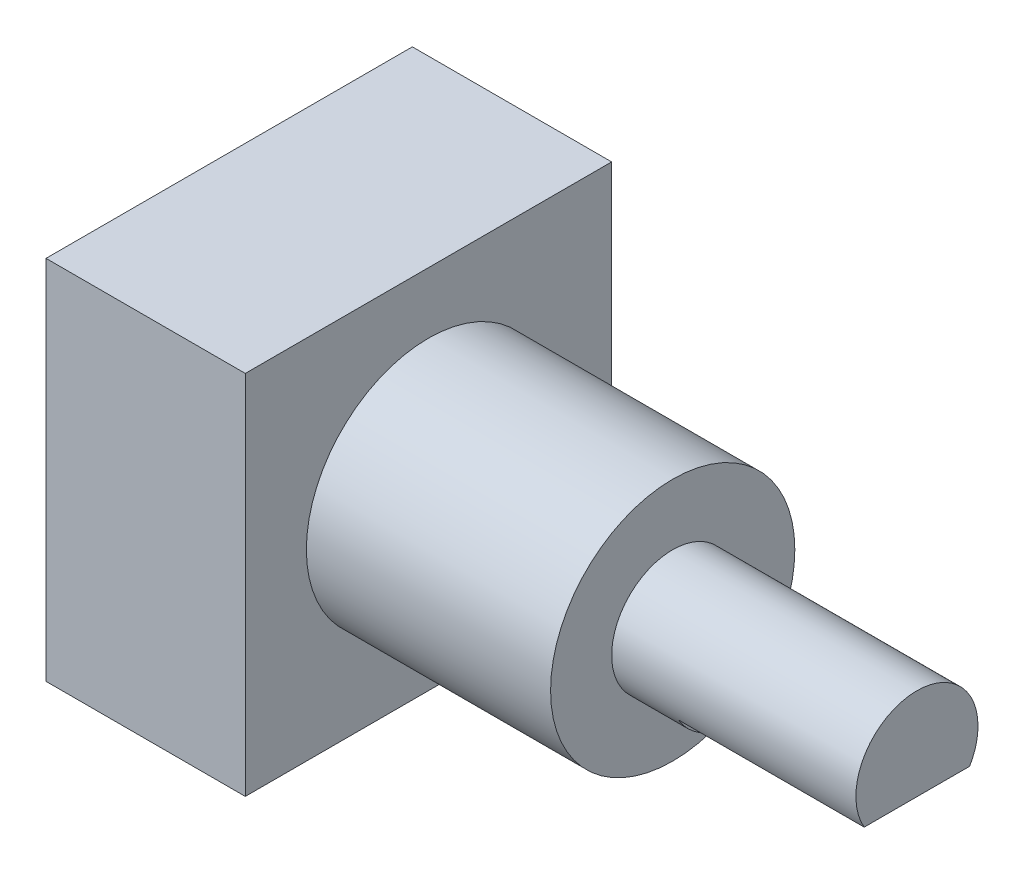
ISO-10303-21;
HEADER;
FILE_DESCRIPTION(('STEP AP214'),'2;1');
FILE_NAME('part.step','',(''),(''),'','','');
FILE_SCHEMA(('AUTOMOTIVE_DESIGN { 1 0 10303 214 1 1 1 1 }'));
ENDSEC;
DATA;
#1=APPLICATION_CONTEXT('core data for automotive mechanical design processes');
#2=APPLICATION_PROTOCOL_DEFINITION('international standard','automotive_design',2000,#1);
#3=PRODUCT_CONTEXT('',#1,'mechanical');
#4=PRODUCT('Part','Part','',(#3));
#5=PRODUCT_RELATED_PRODUCT_CATEGORY('part','',(#4));
#6=PRODUCT_DEFINITION_FORMATION('','',#4);
#7=PRODUCT_DEFINITION_CONTEXT('part definition',#1,'design');
#8=PRODUCT_DEFINITION('design','',#6,#7);
#9=PRODUCT_DEFINITION_SHAPE('','',#8);
#10=(LENGTH_UNIT() NAMED_UNIT(*) SI_UNIT(.MILLI.,.METRE.));
#11=(NAMED_UNIT(*) PLANE_ANGLE_UNIT() SI_UNIT($,.RADIAN.));
#12=(NAMED_UNIT(*) SI_UNIT($,.STERADIAN.) SOLID_ANGLE_UNIT());
#13=UNCERTAINTY_MEASURE_WITH_UNIT(LENGTH_MEASURE(1.E-05),#10,'distance_accuracy_value','');
#14=(GEOMETRIC_REPRESENTATION_CONTEXT(3) GLOBAL_UNCERTAINTY_ASSIGNED_CONTEXT((#13)) GLOBAL_UNIT_ASSIGNED_CONTEXT((#10,
#11,#12)) REPRESENTATION_CONTEXT('',''));
#15=CARTESIAN_POINT('',(0.,0.,0.));
#16=DIRECTION('',(0.,0.,1.));
#17=DIRECTION('',(1.,0.,0.));
#18=AXIS2_PLACEMENT_3D('',#15,#16,#17);
#19=CARTESIAN_POINT('',(0.,0.,0.));
#20=DIRECTION('',(1.,0.,0.));
#21=DIRECTION('',(0.,0.,-1.));
#22=AXIS2_PLACEMENT_3D('',#19,#20,#21);
#23=CYLINDRICAL_SURFACE('',#22,3.175);
#24=CARTESIAN_POINT('',(0.,0.,0.));
#25=DIRECTION('',(-1.,0.,0.));
#26=DIRECTION('',(0.,0.,1.));
#27=AXIS2_PLACEMENT_3D('',#24,#25,#26);
#28=CIRCLE('',#27,3.175);
#29=CARTESIAN_POINT('',(0.,0.,3.175));
#30=VERTEX_POINT('',#29);
#31=EDGE_CURVE('E138',#30,#30,#28,.F.);
#32=ORIENTED_EDGE('',*,*,#31,.T.);
#33=EDGE_LOOP('',(#32));
#34=FACE_BOUND('',#33,.T.);
#35=CARTESIAN_POINT('',(6.35,0.,0.));
#36=DIRECTION('',(1.,0.,0.));
#37=DIRECTION('',(0.,0.,-1.));
#38=AXIS2_PLACEMENT_3D('',#35,#36,#37);
#39=CIRCLE('',#38,3.175);
#40=CARTESIAN_POINT('',(6.35,0.,-3.175));
#41=VERTEX_POINT('',#40);
#42=EDGE_CURVE('E11',#41,#41,#39,.T.);
#43=ORIENTED_EDGE('',*,*,#42,.F.);
#44=EDGE_LOOP('',(#43));
#45=FACE_BOUND('',#44,.T.);
#46=ADVANCED_FACE('F35',(#34,#45),#23,.T.);
#47=CARTESIAN_POINT('',(6.35,3.175,0.));
#48=DIRECTION('',(1.,0.,0.));
#49=DIRECTION('',(0.,0.,-1.));
#50=AXIS2_PLACEMENT_3D('',#47,#48,#49);
#51=PLANE('',#50);
#52=ORIENTED_EDGE('',*,*,#42,.T.);
#53=EDGE_LOOP('',(#52));
#54=FACE_BOUND('',#53,.T.);
#55=CARTESIAN_POINT('',(6.35,0.,0.));
#56=DIRECTION('',(1.,0.,0.));
#57=DIRECTION('',(0.,0.,-1.));
#58=AXIS2_PLACEMENT_3D('',#55,#56,#57);
#59=CIRCLE('',#58,1.5875);
#60=CARTESIAN_POINT('',(6.35,0.,-1.5875));
#61=VERTEX_POINT('',#60);
#62=EDGE_CURVE('E42',#61,#61,#59,.T.);
#63=ORIENTED_EDGE('',*,*,#62,.F.);
#64=EDGE_LOOP('',(#63));
#65=FACE_BOUND('',#64,.T.);
#66=ADVANCED_FACE('F149',(#54,#65),#51,.T.);
#67=CARTESIAN_POINT('',(0.,0.,0.));
#68=DIRECTION('',(1.,0.,0.));
#69=DIRECTION('',(0.,0.,-1.));
#70=AXIS2_PLACEMENT_3D('',#67,#68,#69);
#71=CYLINDRICAL_SURFACE('',#70,1.5875);
#72=DIRECTION('',(1.,0.,0.));
#73=VECTOR('',#72,1.);
#74=CARTESIAN_POINT('',(7.874,-0.800099999999999,1.3711295489486));
#75=LINE('',#74,#73);
#76=CARTESIAN_POINT('',(7.874,-0.800099999999999,1.3711295489486));
#77=VERTEX_POINT('',#76);
#78=CARTESIAN_POINT('',(12.7,-0.800099999999999,1.3711295489486));
#79=VERTEX_POINT('',#78);
#80=EDGE_CURVE('E105',#77,#79,#75,.T.);
#81=ORIENTED_EDGE('',*,*,#80,.T.);
#82=CARTESIAN_POINT('',(12.7,0.,0.));
#83=DIRECTION('',(1.,0.,0.));
#84=DIRECTION('',(0.,0.,-1.));
#85=AXIS2_PLACEMENT_3D('',#82,#83,#84);
#86=CIRCLE('',#85,1.5875);
#87=CARTESIAN_POINT('',(12.7,-0.800099999999999,-1.3711295489486));
#88=VERTEX_POINT('',#87);
#89=EDGE_CURVE('E111',#88,#79,#86,.T.);
#90=ORIENTED_EDGE('',*,*,#89,.F.);
#91=DIRECTION('',(1.,0.,0.));
#92=VECTOR('',#91,1.);
#93=CARTESIAN_POINT('',(7.874,-0.800099999999999,-1.3711295489486));
#94=LINE('',#93,#92);
#95=CARTESIAN_POINT('',(7.874,-0.800099999999999,-1.3711295489486));
#96=VERTEX_POINT('',#95);
#97=EDGE_CURVE('E49',#96,#88,#94,.T.);
#98=ORIENTED_EDGE('',*,*,#97,.F.);
#99=CARTESIAN_POINT('',(7.874,0.,0.));
#100=DIRECTION('',(1.,0.,0.));
#101=DIRECTION('',(0.,0.,-1.));
#102=AXIS2_PLACEMENT_3D('',#99,#100,#101);
#103=CIRCLE('',#102,1.5875);
#104=EDGE_CURVE('E97',#77,#96,#103,.T.);
#105=ORIENTED_EDGE('',*,*,#104,.F.);
#106=EDGE_LOOP('',(#81,#90,#98,#105));
#107=FACE_BOUND('',#106,.T.);
#108=ORIENTED_EDGE('',*,*,#62,.T.);
#109=EDGE_LOOP('',(#108));
#110=FACE_BOUND('',#109,.T.);
#111=ADVANCED_FACE('F108',(#107,#110),#71,.T.);
#112=CARTESIAN_POINT('',(12.7,1.5875,0.));
#113=DIRECTION('',(1.,0.,0.));
#114=DIRECTION('',(0.,0.,-1.));
#115=AXIS2_PLACEMENT_3D('',#112,#113,#114);
#116=PLANE('',#115);
#117=DIRECTION('',(0.,0.,1.));
#118=VECTOR('',#117,1.);
#119=CARTESIAN_POINT('',(12.7,-0.800099999999999,1.3711295489486));
#120=LINE('',#119,#118);
#121=EDGE_CURVE('E102',#88,#79,#120,.T.);
#122=ORIENTED_EDGE('',*,*,#121,.F.);
#123=ORIENTED_EDGE('',*,*,#89,.T.);
#124=EDGE_LOOP('',(#122,#123));
#125=FACE_BOUND('',#124,.T.);
#126=ADVANCED_FACE('F156',(#125),#116,.T.);
#127=CARTESIAN_POINT('',(-5.1816,-4.7625,-4.7625));
#128=DIRECTION('',(0.,0.,-1.));
#129=DIRECTION('',(-1.,0.,0.));
#130=AXIS2_PLACEMENT_3D('',#127,#128,#129);
#131=PLANE('',#130);
#132=DIRECTION('',(0.,1.,0.));
#133=VECTOR('',#132,1.);
#134=CARTESIAN_POINT('',(0.,-4.7625,-4.7625));
#135=LINE('',#134,#133);
#136=CARTESIAN_POINT('',(0.,-4.7625,-4.7625));
#137=VERTEX_POINT('',#136);
#138=CARTESIAN_POINT('',(0.,4.7625,-4.7625));
#139=VERTEX_POINT('',#138);
#140=EDGE_CURVE('E113',#137,#139,#135,.T.);
#141=ORIENTED_EDGE('',*,*,#140,.F.);
#142=DIRECTION('',(1.,0.,0.));
#143=VECTOR('',#142,1.);
#144=CARTESIAN_POINT('',(-5.1816,-4.7625,-4.7625));
#145=LINE('',#144,#143);
#146=CARTESIAN_POINT('',(-5.1816,-4.7625,-4.7625));
#147=VERTEX_POINT('',#146);
#148=EDGE_CURVE('E58',#147,#137,#145,.T.);
#149=ORIENTED_EDGE('',*,*,#148,.F.);
#150=DIRECTION('',(0.,1.,0.));
#151=VECTOR('',#150,1.);
#152=CARTESIAN_POINT('',(-5.1816,-4.7625,-4.7625));
#153=LINE('',#152,#151);
#154=CARTESIAN_POINT('',(-5.1816,4.7625,-4.7625));
#155=VERTEX_POINT('',#154);
#156=EDGE_CURVE('E117',#147,#155,#153,.T.);
#157=ORIENTED_EDGE('',*,*,#156,.T.);
#158=DIRECTION('',(1.,0.,0.));
#159=VECTOR('',#158,1.);
#160=CARTESIAN_POINT('',(-5.1816,4.7625,-4.7625));
#161=LINE('',#160,#159);
#162=EDGE_CURVE('E84',#155,#139,#161,.T.);
#163=ORIENTED_EDGE('',*,*,#162,.T.);
#164=EDGE_LOOP('',(#141,#149,#157,#163));
#165=FACE_BOUND('',#164,.T.);
#166=ADVANCED_FACE('F162',(#165),#131,.T.);
#167=CARTESIAN_POINT('',(-5.1816,-4.7625,4.7625));
#168=DIRECTION('',(0.,-1.,0.));
#169=DIRECTION('',(0.,0.,-1.));
#170=AXIS2_PLACEMENT_3D('',#167,#168,#169);
#171=PLANE('',#170);
#172=DIRECTION('',(0.,0.,-1.));
#173=VECTOR('',#172,1.);
#174=CARTESIAN_POINT('',(0.,-4.7625,4.7625));
#175=LINE('',#174,#173);
#176=CARTESIAN_POINT('',(0.,-4.7625,4.7625));
#177=VERTEX_POINT('',#176);
#178=EDGE_CURVE('E120',#177,#137,#175,.T.);
#179=ORIENTED_EDGE('',*,*,#178,.F.);
#180=DIRECTION('',(1.,0.,0.));
#181=VECTOR('',#180,1.);
#182=CARTESIAN_POINT('',(-5.1816,-4.7625,4.7625));
#183=LINE('',#182,#181);
#184=CARTESIAN_POINT('',(-5.1816,-4.7625,4.7625));
#185=VERTEX_POINT('',#184);
#186=EDGE_CURVE('E139',#185,#177,#183,.T.);
#187=ORIENTED_EDGE('',*,*,#186,.F.);
#188=DIRECTION('',(0.,0.,-1.));
#189=VECTOR('',#188,1.);
#190=CARTESIAN_POINT('',(-5.1816,-4.7625,4.7625));
#191=LINE('',#190,#189);
#192=EDGE_CURVE('E125',#185,#147,#191,.T.);
#193=ORIENTED_EDGE('',*,*,#192,.T.);
#194=ORIENTED_EDGE('',*,*,#148,.T.);
#195=EDGE_LOOP('',(#179,#187,#193,#194));
#196=FACE_BOUND('',#195,.T.);
#197=ADVANCED_FACE('F166',(#196),#171,.T.);
#198=CARTESIAN_POINT('',(-5.1816,-4.7625,4.7625));
#199=DIRECTION('',(0.,0.,1.));
#200=DIRECTION('',(1.,0.,0.));
#201=AXIS2_PLACEMENT_3D('',#198,#199,#200);
#202=PLANE('',#201);
#203=DIRECTION('',(0.,-1.,0.));
#204=VECTOR('',#203,1.);
#205=CARTESIAN_POINT('',(0.,-4.7625,4.7625));
#206=LINE('',#205,#204);
#207=CARTESIAN_POINT('',(0.,4.7625,4.7625));
#208=VERTEX_POINT('',#207);
#209=EDGE_CURVE('E132',#208,#177,#206,.T.);
#210=ORIENTED_EDGE('',*,*,#209,.F.);
#211=DIRECTION('',(1.,0.,0.));
#212=VECTOR('',#211,1.);
#213=CARTESIAN_POINT('',(-5.1816,4.7625,4.7625));
#214=LINE('',#213,#212);
#215=CARTESIAN_POINT('',(-5.1816,4.7625,4.7625));
#216=VERTEX_POINT('',#215);
#217=EDGE_CURVE('E141',#216,#208,#214,.T.);
#218=ORIENTED_EDGE('',*,*,#217,.F.);
#219=DIRECTION('',(0.,-1.,0.));
#220=VECTOR('',#219,1.);
#221=CARTESIAN_POINT('',(-5.1816,-4.7625,4.7625));
#222=LINE('',#221,#220);
#223=EDGE_CURVE('E122',#216,#185,#222,.T.);
#224=ORIENTED_EDGE('',*,*,#223,.T.);
#225=ORIENTED_EDGE('',*,*,#186,.T.);
#226=EDGE_LOOP('',(#210,#218,#224,#225));
#227=FACE_BOUND('',#226,.T.);
#228=ADVANCED_FACE('F171',(#227),#202,.T.);
#229=CARTESIAN_POINT('',(-5.1816,4.7625,4.7625));
#230=DIRECTION('',(0.,1.,0.));
#231=DIRECTION('',(0.,0.,1.));
#232=AXIS2_PLACEMENT_3D('',#229,#230,#231);
#233=PLANE('',#232);
#234=DIRECTION('',(0.,0.,1.));
#235=VECTOR('',#234,1.);
#236=CARTESIAN_POINT('',(0.,4.7625,4.7625));
#237=LINE('',#236,#235);
#238=EDGE_CURVE('E129',#139,#208,#237,.T.);
#239=ORIENTED_EDGE('',*,*,#238,.F.);
#240=ORIENTED_EDGE('',*,*,#162,.F.);
#241=DIRECTION('',(0.,0.,1.));
#242=VECTOR('',#241,1.);
#243=CARTESIAN_POINT('',(-5.1816,4.7625,4.7625));
#244=LINE('',#243,#242);
#245=EDGE_CURVE('E119',#155,#216,#244,.T.);
#246=ORIENTED_EDGE('',*,*,#245,.T.);
#247=ORIENTED_EDGE('',*,*,#217,.T.);
#248=EDGE_LOOP('',(#239,#240,#246,#247));
#249=FACE_BOUND('',#248,.T.);
#250=ADVANCED_FACE('F167',(#249),#233,.T.);
#251=CARTESIAN_POINT('',(-5.1816,0.,0.));
#252=DIRECTION('',(-1.,0.,0.));
#253=DIRECTION('',(0.,0.,1.));
#254=AXIS2_PLACEMENT_3D('',#251,#252,#253);
#255=PLANE('',#254);
#256=ORIENTED_EDGE('',*,*,#156,.F.);
#257=ORIENTED_EDGE('',*,*,#192,.F.);
#258=ORIENTED_EDGE('',*,*,#223,.F.);
#259=ORIENTED_EDGE('',*,*,#245,.F.);
#260=EDGE_LOOP('',(#256,#257,#258,#259));
#261=FACE_BOUND('',#260,.T.);
#262=ADVANCED_FACE('F170',(#261),#255,.T.);
#263=CARTESIAN_POINT('',(0.,0.,0.));
#264=DIRECTION('',(-1.,0.,0.));
#265=DIRECTION('',(0.,0.,1.));
#266=AXIS2_PLACEMENT_3D('',#263,#264,#265);
#267=PLANE('',#266);
#268=ORIENTED_EDGE('',*,*,#31,.F.);
#269=EDGE_LOOP('',(#268));
#270=FACE_BOUND('',#269,.T.);
#271=ORIENTED_EDGE('',*,*,#140,.T.);
#272=ORIENTED_EDGE('',*,*,#238,.T.);
#273=ORIENTED_EDGE('',*,*,#209,.T.);
#274=ORIENTED_EDGE('',*,*,#178,.T.);
#275=EDGE_LOOP('',(#271,#272,#273,#274));
#276=FACE_BOUND('',#275,.T.);
#277=ADVANCED_FACE('F177',(#270,#276),#267,.F.);
#278=CARTESIAN_POINT('',(7.874,-0.800099999999999,1.3711295489486));
#279=DIRECTION('',(0.,1.,0.));
#280=DIRECTION('',(0.,0.,1.));
#281=AXIS2_PLACEMENT_3D('',#278,#279,#280);
#282=PLANE('',#281);
#283=ORIENTED_EDGE('',*,*,#121,.T.);
#284=ORIENTED_EDGE('',*,*,#80,.F.);
#285=DIRECTION('',(0.,0.,1.));
#286=VECTOR('',#285,1.);
#287=CARTESIAN_POINT('',(7.874,-0.800099999999999,1.3711295489486));
#288=LINE('',#287,#286);
#289=EDGE_CURVE('E99',#96,#77,#288,.T.);
#290=ORIENTED_EDGE('',*,*,#289,.F.);
#291=ORIENTED_EDGE('',*,*,#97,.T.);
#292=EDGE_LOOP('',(#283,#284,#290,#291));
#293=FACE_BOUND('',#292,.T.);
#294=ADVANCED_FACE('F104',(#293),#282,.F.);
#295=CARTESIAN_POINT('',(7.874,0.,0.));
#296=DIRECTION('',(1.,0.,0.));
#297=DIRECTION('',(0.,0.,-1.));
#298=AXIS2_PLACEMENT_3D('',#295,#296,#297);
#299=PLANE('',#298);
#300=ORIENTED_EDGE('',*,*,#104,.T.);
#301=ORIENTED_EDGE('',*,*,#289,.T.);
#302=EDGE_LOOP('',(#300,#301));
#303=FACE_BOUND('',#302,.T.);
#304=ADVANCED_FACE('F98',(#303),#299,.T.);
#305=CLOSED_SHELL('',(#46,#66,#111,#126,#166,#197,#228,#250,#262,#277,#294,#304));
#306=MANIFOLD_SOLID_BREP('B2',#305);
#307=ADVANCED_BREP_SHAPE_REPRESENTATION('',(#18,#306),#14);
#308=SHAPE_DEFINITION_REPRESENTATION(#9,#307);
ENDSEC;
END-ISO-10303-21;
